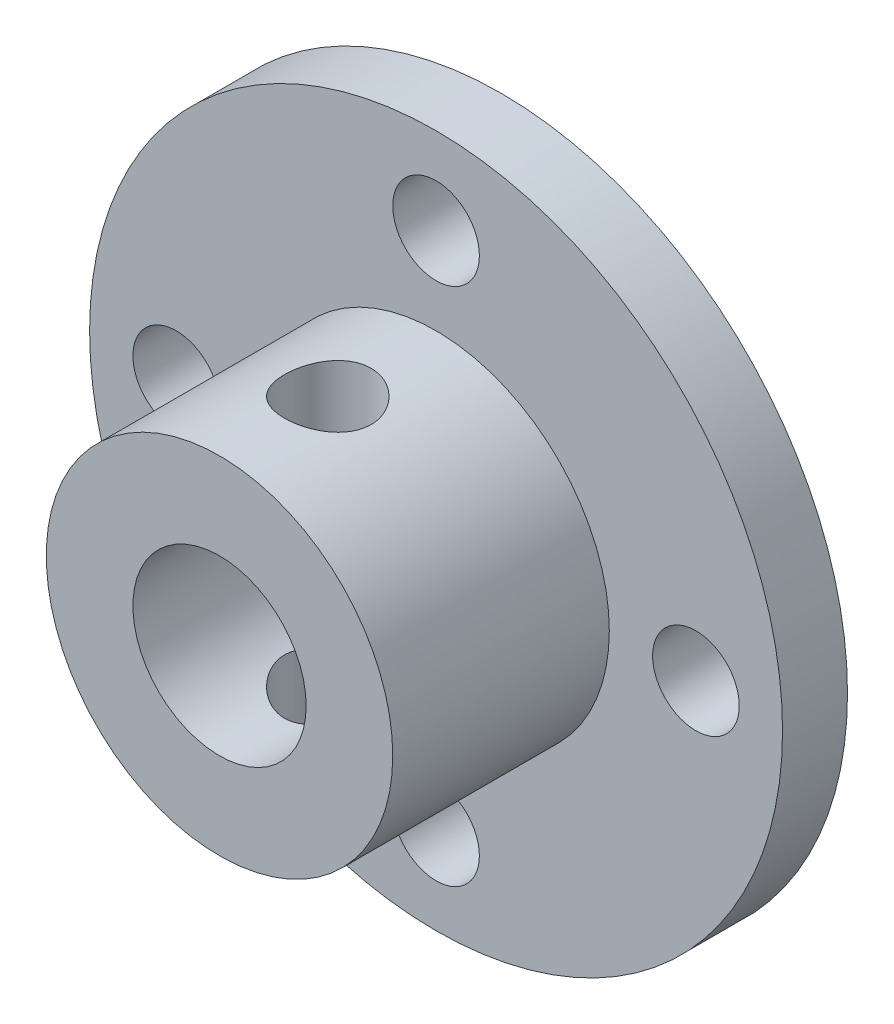
ISO-10303-21;
HEADER;
FILE_DESCRIPTION(('STEP AP214'),'2;1');
FILE_NAME('part.step','',(''),(''),'','','');
FILE_SCHEMA(('AUTOMOTIVE_DESIGN { 1 0 10303 214 1 1 1 1 }'));
ENDSEC;
DATA;
#1=APPLICATION_CONTEXT('core data for automotive mechanical design processes');
#2=APPLICATION_PROTOCOL_DEFINITION('international standard','automotive_design',2000,#1);
#3=PRODUCT_CONTEXT('',#1,'mechanical');
#4=PRODUCT('Part','Part','',(#3));
#5=PRODUCT_RELATED_PRODUCT_CATEGORY('part','',(#4));
#6=PRODUCT_DEFINITION_FORMATION('','',#4);
#7=PRODUCT_DEFINITION_CONTEXT('part definition',#1,'design');
#8=PRODUCT_DEFINITION('design','',#6,#7);
#9=PRODUCT_DEFINITION_SHAPE('','',#8);
#10=(LENGTH_UNIT() NAMED_UNIT(*) SI_UNIT(.MILLI.,.METRE.));
#11=(NAMED_UNIT(*) PLANE_ANGLE_UNIT() SI_UNIT($,.RADIAN.));
#12=(NAMED_UNIT(*) SI_UNIT($,.STERADIAN.) SOLID_ANGLE_UNIT());
#13=UNCERTAINTY_MEASURE_WITH_UNIT(LENGTH_MEASURE(1.E-05),#10,'distance_accuracy_value','');
#14=(GEOMETRIC_REPRESENTATION_CONTEXT(3) GLOBAL_UNCERTAINTY_ASSIGNED_CONTEXT((#13)) GLOBAL_UNIT_ASSIGNED_CONTEXT((#10,
#11,#12)) REPRESENTATION_CONTEXT('',''));
#15=CARTESIAN_POINT('',(0.,0.,0.));
#16=DIRECTION('',(0.,0.,1.));
#17=DIRECTION('',(1.,0.,0.));
#18=AXIS2_PLACEMENT_3D('',#15,#16,#17);
#19=CARTESIAN_POINT('',(0.,0.,3.));
#20=DIRECTION('',(0.,0.,-1.));
#21=DIRECTION('',(-1.,0.,0.));
#22=AXIS2_PLACEMENT_3D('',#19,#20,#21);
#23=CYLINDRICAL_SURFACE('',#22,16.);
#24=CARTESIAN_POINT('',(0.,0.,3.));
#25=DIRECTION('',(0.,0.,1.));
#26=DIRECTION('',(1.,0.,0.));
#27=AXIS2_PLACEMENT_3D('',#24,#25,#26);
#28=CIRCLE('',#27,16.);
#29=CARTESIAN_POINT('',(16.,0.,3.));
#30=VERTEX_POINT('',#29);
#31=EDGE_CURVE('E11',#30,#30,#28,.T.);
#32=ORIENTED_EDGE('',*,*,#31,.F.);
#33=EDGE_LOOP('',(#32));
#34=FACE_BOUND('',#33,.T.);
#35=CARTESIAN_POINT('',(0.,0.,0.));
#36=DIRECTION('',(0.,0.,1.));
#37=DIRECTION('',(1.,0.,0.));
#38=AXIS2_PLACEMENT_3D('',#35,#36,#37);
#39=CIRCLE('',#38,16.);
#40=CARTESIAN_POINT('',(16.,0.,0.));
#41=VERTEX_POINT('',#40);
#42=EDGE_CURVE('E44',#41,#41,#39,.T.);
#43=ORIENTED_EDGE('',*,*,#42,.T.);
#44=EDGE_LOOP('',(#43));
#45=FACE_BOUND('',#44,.T.);
#46=ADVANCED_FACE('F37',(#34,#45),#23,.T.);
#47=CARTESIAN_POINT('',(0.,0.,3.));
#48=DIRECTION('',(0.,0.,1.));
#49=DIRECTION('',(1.,0.,0.));
#50=AXIS2_PLACEMENT_3D('',#47,#48,#49);
#51=PLANE('',#50);
#52=CARTESIAN_POINT('',(0.,12.,3.));
#53=DIRECTION('',(0.,0.,1.));
#54=DIRECTION('',(1.,0.,0.));
#55=AXIS2_PLACEMENT_3D('',#52,#53,#54);
#56=CIRCLE('',#55,2.);
#57=CARTESIAN_POINT('',(2.,12.,3.));
#58=VERTEX_POINT('',#57);
#59=EDGE_CURVE('E246',#58,#58,#56,.T.);
#60=ORIENTED_EDGE('',*,*,#59,.F.);
#61=EDGE_LOOP('',(#60));
#62=FACE_BOUND('',#61,.T.);
#63=CARTESIAN_POINT('',(12.,0.,3.));
#64=DIRECTION('',(0.,0.,1.));
#65=DIRECTION('',(1.,0.,0.));
#66=AXIS2_PLACEMENT_3D('',#63,#64,#65);
#67=CIRCLE('',#66,2.);
#68=CARTESIAN_POINT('',(14.,0.,3.));
#69=VERTEX_POINT('',#68);
#70=EDGE_CURVE('E269',#69,#69,#67,.T.);
#71=ORIENTED_EDGE('',*,*,#70,.F.);
#72=EDGE_LOOP('',(#71));
#73=FACE_BOUND('',#72,.T.);
#74=CARTESIAN_POINT('',(0.,-12.,3.));
#75=DIRECTION('',(0.,0.,1.));
#76=DIRECTION('',(1.,0.,0.));
#77=AXIS2_PLACEMENT_3D('',#74,#75,#76);
#78=CIRCLE('',#77,2.);
#79=CARTESIAN_POINT('',(2.,-12.,3.));
#80=VERTEX_POINT('',#79);
#81=EDGE_CURVE('E263',#80,#80,#78,.T.);
#82=ORIENTED_EDGE('',*,*,#81,.F.);
#83=EDGE_LOOP('',(#82));
#84=FACE_BOUND('',#83,.T.);
#85=CARTESIAN_POINT('',(-12.,0.,3.));
#86=DIRECTION('',(0.,0.,1.));
#87=DIRECTION('',(1.,0.,0.));
#88=AXIS2_PLACEMENT_3D('',#85,#86,#87);
#89=CIRCLE('',#88,2.);
#90=CARTESIAN_POINT('',(-10.,0.,3.));
#91=VERTEX_POINT('',#90);
#92=EDGE_CURVE('E257',#91,#91,#89,.T.);
#93=ORIENTED_EDGE('',*,*,#92,.F.);
#94=EDGE_LOOP('',(#93));
#95=FACE_BOUND('',#94,.T.);
#96=CARTESIAN_POINT('',(0.,0.,3.));
#97=DIRECTION('',(0.,0.,1.));
#98=DIRECTION('',(1.,0.,0.));
#99=AXIS2_PLACEMENT_3D('',#96,#97,#98);
#100=CIRCLE('',#99,8.);
#101=CARTESIAN_POINT('',(8.,0.,3.));
#102=VERTEX_POINT('',#101);
#103=EDGE_CURVE('E52',#102,#102,#100,.T.);
#104=ORIENTED_EDGE('',*,*,#103,.F.);
#105=EDGE_LOOP('',(#104));
#106=FACE_BOUND('',#105,.T.);
#107=ORIENTED_EDGE('',*,*,#31,.T.);
#108=EDGE_LOOP('',(#107));
#109=FACE_BOUND('',#108,.T.);
#110=ADVANCED_FACE('F100',(#62,#73,#84,#95,#106,#109),#51,.T.);
#111=CARTESIAN_POINT('',(0.,0.,0.));
#112=DIRECTION('',(0.,0.,1.));
#113=DIRECTION('',(1.,0.,0.));
#114=AXIS2_PLACEMENT_3D('',#111,#112,#113);
#115=PLANE('',#114);
#116=CARTESIAN_POINT('',(0.,0.,0.));
#117=DIRECTION('',(0.,0.,1.));
#118=DIRECTION('',(1.,0.,0.));
#119=AXIS2_PLACEMENT_3D('',#116,#117,#118);
#120=CIRCLE('',#119,4.);
#121=CARTESIAN_POINT('',(4.,0.,0.));
#122=VERTEX_POINT('',#121);
#123=EDGE_CURVE('E40',#122,#122,#120,.T.);
#124=ORIENTED_EDGE('',*,*,#123,.T.);
#125=EDGE_LOOP('',(#124));
#126=FACE_BOUND('',#125,.T.);
#127=CARTESIAN_POINT('',(0.,12.,0.));
#128=DIRECTION('',(0.,0.,1.));
#129=DIRECTION('',(1.,0.,0.));
#130=AXIS2_PLACEMENT_3D('',#127,#128,#129);
#131=CIRCLE('',#130,2.);
#132=CARTESIAN_POINT('',(2.,12.,0.));
#133=VERTEX_POINT('',#132);
#134=EDGE_CURVE('E242',#133,#133,#131,.T.);
#135=ORIENTED_EDGE('',*,*,#134,.T.);
#136=EDGE_LOOP('',(#135));
#137=FACE_BOUND('',#136,.T.);
#138=CARTESIAN_POINT('',(12.,0.,0.));
#139=DIRECTION('',(0.,0.,1.));
#140=DIRECTION('',(1.,0.,0.));
#141=AXIS2_PLACEMENT_3D('',#138,#139,#140);
#142=CIRCLE('',#141,2.);
#143=CARTESIAN_POINT('',(14.,0.,0.));
#144=VERTEX_POINT('',#143);
#145=EDGE_CURVE('E266',#144,#144,#142,.T.);
#146=ORIENTED_EDGE('',*,*,#145,.T.);
#147=EDGE_LOOP('',(#146));
#148=FACE_BOUND('',#147,.T.);
#149=CARTESIAN_POINT('',(0.,-12.,0.));
#150=DIRECTION('',(0.,0.,1.));
#151=DIRECTION('',(1.,0.,0.));
#152=AXIS2_PLACEMENT_3D('',#149,#150,#151);
#153=CIRCLE('',#152,2.);
#154=CARTESIAN_POINT('',(2.,-12.,0.));
#155=VERTEX_POINT('',#154);
#156=EDGE_CURVE('E260',#155,#155,#153,.T.);
#157=ORIENTED_EDGE('',*,*,#156,.T.);
#158=EDGE_LOOP('',(#157));
#159=FACE_BOUND('',#158,.T.);
#160=CARTESIAN_POINT('',(-12.,0.,0.));
#161=DIRECTION('',(0.,0.,1.));
#162=DIRECTION('',(1.,0.,0.));
#163=AXIS2_PLACEMENT_3D('',#160,#161,#162);
#164=CIRCLE('',#163,2.);
#165=CARTESIAN_POINT('',(-10.,0.,0.));
#166=VERTEX_POINT('',#165);
#167=EDGE_CURVE('E248',#166,#166,#164,.T.);
#168=ORIENTED_EDGE('',*,*,#167,.T.);
#169=EDGE_LOOP('',(#168));
#170=FACE_BOUND('',#169,.T.);
#171=ORIENTED_EDGE('',*,*,#42,.F.);
#172=EDGE_LOOP('',(#171));
#173=FACE_BOUND('',#172,.T.);
#174=ADVANCED_FACE('F103',(#126,#137,#148,#159,#170,#173),#115,.F.);
#175=CARTESIAN_POINT('',(0.,0.,13.));
#176=DIRECTION('',(0.,0.,1.));
#177=DIRECTION('',(1.,0.,0.));
#178=AXIS2_PLACEMENT_3D('',#175,#176,#177);
#179=PLANE('',#178);
#180=CARTESIAN_POINT('',(0.,0.,13.));
#181=DIRECTION('',(0.,0.,1.));
#182=DIRECTION('',(1.,0.,0.));
#183=AXIS2_PLACEMENT_3D('',#180,#181,#182);
#184=CIRCLE('',#183,8.);
#185=CARTESIAN_POINT('',(8.,0.,13.));
#186=VERTEX_POINT('',#185);
#187=EDGE_CURVE('E49',#186,#186,#184,.T.);
#188=ORIENTED_EDGE('',*,*,#187,.T.);
#189=EDGE_LOOP('',(#188));
#190=FACE_BOUND('',#189,.T.);
#191=CARTESIAN_POINT('',(0.,0.,13.));
#192=DIRECTION('',(0.,0.,1.));
#193=DIRECTION('',(1.,0.,0.));
#194=AXIS2_PLACEMENT_3D('',#191,#192,#193);
#195=CIRCLE('',#194,4.);
#196=CARTESIAN_POINT('',(4.,0.,13.));
#197=VERTEX_POINT('',#196);
#198=EDGE_CURVE('E239',#197,#197,#195,.T.);
#199=ORIENTED_EDGE('',*,*,#198,.F.);
#200=EDGE_LOOP('',(#199));
#201=FACE_BOUND('',#200,.T.);
#202=ADVANCED_FACE('F98',(#190,#201),#179,.T.);
#203=CARTESIAN_POINT('',(0.,0.,13.));
#204=DIRECTION('',(0.,0.,-1.));
#205=DIRECTION('',(-1.,0.,0.));
#206=AXIS2_PLACEMENT_3D('',#203,#204,#205);
#207=CYLINDRICAL_SURFACE('',#206,8.);
#208=CARTESIAN_POINT('',(0.,-8.,10.));
#209=CARTESIAN_POINT('',(0.110501451559642,-7.9999981315735,9.99999689901579));
#210=CARTESIAN_POINT('',(0.221037543774351,-7.99768770842435,9.99081126563495));
#211=CARTESIAN_POINT('',(0.438941765027377,-7.98869485106526,9.95436646492399));
#212=CARTESIAN_POINT('',(0.546308062494319,-7.98200993893301,9.92709705394953));
#213=CARTESIAN_POINT('',(0.754694496243435,-7.96500835109376,9.85541432871722));
#214=CARTESIAN_POINT('',(0.855722084573335,-7.95469603789411,9.81102160171298));
#215=CARTESIAN_POINT('',(1.04889617587257,-7.93153791743495,9.70642481327355));
#216=CARTESIAN_POINT('',(1.14104237913168,-7.91869202472209,9.64622021850804));
#217=CARTESIAN_POINT('',(1.31573590306789,-7.89156551455591,9.51039894712776));
#218=CARTESIAN_POINT('',(1.39807425341474,-7.87726276197502,9.43451790005459));
#219=CARTESIAN_POINT('',(1.54899856960443,-7.84898160157248,9.27006372678795));
#220=CARTESIAN_POINT('',(1.61758298259892,-7.83500323053157,9.18148916940409));
#221=CARTESIAN_POINT('',(1.74003539039863,-7.80873034264225,8.99253969768401));
#222=CARTESIAN_POINT('',(1.79366962123352,-7.79646392619748,8.89200902558836));
#223=CARTESIAN_POINT('',(1.88319587806766,-7.77532659757355,8.68300211778662));
#224=CARTESIAN_POINT('',(1.91909074058685,-7.76645514259225,8.57452715555731));
#225=CARTESIAN_POINT('',(1.97140644907302,-7.7533396892843,8.35500866906445));
#226=CARTESIAN_POINT('',(1.98820302444274,-7.74900654662681,8.24406013861601));
#227=CARTESIAN_POINT('',(2.00301570008854,-7.74519149946122,8.02084190800087));
#228=CARTESIAN_POINT('',(2.00103485575748,-7.74570880570571,7.90857242574382));
#229=CARTESIAN_POINT('',(1.97864869951961,-7.75145607355756,7.6887789230062));
#230=CARTESIAN_POINT('',(1.95869112025418,-7.75657150676391,7.58120583804623));
#231=CARTESIAN_POINT('',(1.90163224920399,-7.77075612894758,7.37098526545192));
#232=CARTESIAN_POINT('',(1.86452973609252,-7.77982559958985,7.26833812929477));
#233=CARTESIAN_POINT('',(1.77385263724958,-7.80100151874212,7.06968264499716));
#234=CARTESIAN_POINT('',(1.72011555631056,-7.81313769959755,6.97375177094724));
#235=CARTESIAN_POINT('',(1.59780836801993,-7.83906281127988,6.79210838699091));
#236=CARTESIAN_POINT('',(1.52923566507845,-7.85285203112837,6.70639766924367));
#237=CARTESIAN_POINT('',(1.37688456624163,-7.88101174053188,6.54506184574079));
#238=CARTESIAN_POINT('',(1.29272834422115,-7.89538759304001,6.46979401325153));
#239=CARTESIAN_POINT('',(1.11281589000493,-7.92274620771675,6.3343716767148));
#240=CARTESIAN_POINT('',(1.01705930361059,-7.93572892732543,6.27421763431525));
#241=CARTESIAN_POINT('',(0.816154518241856,-7.9589030945892,6.17059921836749));
#242=CARTESIAN_POINT('',(0.710975190944831,-7.96908480170303,6.12719287966076));
#243=CARTESIAN_POINT('',(0.49450134419051,-7.98543889321888,6.05877692572057));
#244=CARTESIAN_POINT('',(0.383207998867313,-7.99161204452374,6.03376379144248));
#245=CARTESIAN_POINT('',(0.160719960520036,-7.999139990285,6.00338991258822));
#246=CARTESIAN_POINT('',(0.0495956266509465,-8.00061404677705,5.9975426318996));
#247=CARTESIAN_POINT('',(-0.172043833068677,-7.99891739752601,6.00433200274065));
#248=CARTESIAN_POINT('',(-0.28255901285946,-7.99574710989128,6.01696699039884));
#249=CARTESIAN_POINT('',(-0.498152358368656,-7.98519441503143,6.05996121118851));
#250=CARTESIAN_POINT('',(-0.603286825291673,-7.97787512247748,6.09005501796932));
#251=CARTESIAN_POINT('',(-0.807009723270016,-7.95984942178845,6.16680944537126));
#252=CARTESIAN_POINT('',(-0.905597492043513,-7.94914267159856,6.21347173908423));
#253=CARTESIAN_POINT('',(-1.0953641792398,-7.92524410568414,6.3229815051663));
#254=CARTESIAN_POINT('',(-1.18638058911444,-7.91201156489243,6.38610148319568));
#255=CARTESIAN_POINT('',(-1.35670215152433,-7.88459345583226,6.52638654506263));
#256=CARTESIAN_POINT('',(-1.43600527863068,-7.87040772335606,6.60355405282254));
#257=CARTESIAN_POINT('',(-1.58265409076364,-7.84225275947695,6.77200261445929));
#258=CARTESIAN_POINT('',(-1.64965849016271,-7.82829738916375,6.86358360400323));
#259=CARTESIAN_POINT('',(-1.7673476786836,-7.80257171169652,7.05697684595429));
#260=CARTESIAN_POINT('',(-1.81803319221058,-7.79080130756035,7.15878864394634));
#261=CARTESIAN_POINT('',(-1.90126856081239,-7.77090792979553,7.36920762988411));
#262=CARTESIAN_POINT('',(-1.93392586220542,-7.76276340389207,7.47777017112535));
#263=CARTESIAN_POINT('',(-1.98046087993837,-7.75102325453578,7.69907951718548));
#264=CARTESIAN_POINT('',(-1.99434270330488,-7.74742663626582,7.81182540137665));
#265=CARTESIAN_POINT('',(-2.00271812044533,-7.74526534938609,8.03482803180694));
#266=CARTESIAN_POINT('',(-1.99775719704016,-7.74655910304351,8.14506324683297));
#267=CARTESIAN_POINT('',(-1.96983637108382,-7.7537054534379,8.36307185155731));
#268=CARTESIAN_POINT('',(-1.94687683024903,-7.75955795855809,8.47084529068487));
#269=CARTESIAN_POINT('',(-1.88390842592373,-7.77508347576963,8.68027794542054));
#270=CARTESIAN_POINT('',(-1.84400187290717,-7.78473353648412,8.78196974032028));
#271=CARTESIAN_POINT('',(-1.74835321814009,-7.80677007633105,8.97728717695159));
#272=CARTESIAN_POINT('',(-1.69260892004558,-7.81915693494364,9.07091169758256));
#273=CARTESIAN_POINT('',(-1.56515699818285,-7.8456751235135,9.25007283866936));
#274=CARTESIAN_POINT('',(-1.49307088388301,-7.85984353109009,9.33533476456528));
#275=CARTESIAN_POINT('',(-1.33571916158631,-7.88810702995048,9.49272939306054));
#276=CARTESIAN_POINT('',(-1.25045042834819,-7.90220210302746,9.56485897348396));
#277=CARTESIAN_POINT('',(-1.06729011560345,-7.92903540863551,9.69521507808614));
#278=CARTESIAN_POINT('',(-0.96919789642185,-7.94174444487824,9.75316615156211));
#279=CARTESIAN_POINT('',(-0.764354746013969,-7.96406566633491,9.85166328392071));
#280=CARTESIAN_POINT('',(-0.65761008458232,-7.97368006933042,9.89222181419805));
#281=CARTESIAN_POINT('',(-0.459213670991295,-7.98730746087389,9.94876244043954));
#282=CARTESIAN_POINT('',(-0.368506894544091,-7.9920344673692,9.96793499073791));
#283=CARTESIAN_POINT('',(-0.185208095381711,-7.99838140309264,9.99355459149592));
#284=CARTESIAN_POINT('',(-0.0926162149901549,-8.00000156601192,10.0000025990737));
#285=CARTESIAN_POINT('',(0.,-8.,10.));
#286=B_SPLINE_CURVE_WITH_KNOTS('',3,(#208,#209,#210,#211,#212,#213,#214,#215,#216,#217,#218,
#219,#220,#221,#222,#223,#224,#225,#226,#227,#228,#229,#230,#231,#232,#233,#234,#235,#236,#237,
#238,#239,#240,#241,#242,#243,#244,#245,#246,#247,#248,#249,#250,#251,#252,#253,#254,#255,#256,
#257,#258,#259,#260,#261,#262,#263,#264,#265,#266,#267,#268,#269,#270,#271,#272,#273,#274,#275,
#276,#277,#278,#279,#280,#281,#282,#283,#284,#285),.UNSPECIFIED.,.T.,.F.,(4,2,2,2,2,2,2,2,2,2,2,
2,2,2,2,2,2,2,2,2,2,2,2,2,2,2,2,2,2,2,2,2,2,2,2,2,2,2,4),(0.,0.33116494996252,0.662517650351866,
0.99347320304814,1.32443992022577,1.66152580582852,1.99864972773416,2.34078196727742,
2.68285948225824,3.01808393468093,3.3532538415469,3.68029996013785,4.00736937959145,
4.337740371696,4.66816921119311,5.00802001296453,5.34788119415424,5.6889097201658,
6.02987298255951,6.36211078603462,6.69431868154751,7.02160366023144,7.34892169767481,
7.68204783424897,8.01523150681786,8.35659345610396,8.69794025003772,9.03723006156476,
9.37644564340972,9.70591707202578,10.0353818794581,10.3628853408369,10.6904342418696,
11.0265276855097,11.3627009303165,11.7049624733721,12.0469781843289,12.3245632392729,
12.6021274139515),.UNSPECIFIED.);
#287=CARTESIAN_POINT('',(0.,-8.,10.));
#288=VERTEX_POINT('',#287);
#289=EDGE_CURVE('E89',#288,#288,#286,.T.);
#290=ORIENTED_EDGE('',*,*,#289,.T.);
#291=EDGE_LOOP('',(#290));
#292=FACE_BOUND('',#291,.T.);
#293=CARTESIAN_POINT('',(0.,8.,10.));
#294=CARTESIAN_POINT('',(-0.110501451559642,7.9999981315735,9.99999689901579));
#295=CARTESIAN_POINT('',(-0.221037543774351,7.99768770842435,9.99081126563495));
#296=CARTESIAN_POINT('',(-0.438941765027377,7.98869485106526,9.95436646492399));
#297=CARTESIAN_POINT('',(-0.546308062494319,7.98200993893301,9.92709705394953));
#298=CARTESIAN_POINT('',(-0.754694496243435,7.96500835109376,9.85541432871722));
#299=CARTESIAN_POINT('',(-0.855722084573335,7.95469603789411,9.81102160171298));
#300=CARTESIAN_POINT('',(-1.04889617587257,7.93153791743495,9.70642481327355));
#301=CARTESIAN_POINT('',(-1.14104237913168,7.91869202472209,9.64622021850804));
#302=CARTESIAN_POINT('',(-1.31573590306789,7.89156551455591,9.51039894712776));
#303=CARTESIAN_POINT('',(-1.39807425341474,7.87726276197502,9.43451790005459));
#304=CARTESIAN_POINT('',(-1.54899856960443,7.84898160157248,9.27006372678795));
#305=CARTESIAN_POINT('',(-1.61758298259892,7.83500323053157,9.18148916940409));
#306=CARTESIAN_POINT('',(-1.74003539039863,7.80873034264225,8.99253969768401));
#307=CARTESIAN_POINT('',(-1.79366962123352,7.79646392619748,8.89200902558836));
#308=CARTESIAN_POINT('',(-1.88319587806766,7.77532659757355,8.68300211778662));
#309=CARTESIAN_POINT('',(-1.91909074058685,7.76645514259225,8.57452715555731));
#310=CARTESIAN_POINT('',(-1.97140644907302,7.7533396892843,8.35500866906445));
#311=CARTESIAN_POINT('',(-1.98820302444274,7.74900654662681,8.24406013861601));
#312=CARTESIAN_POINT('',(-2.00301570008854,7.74519149946122,8.02084190800087));
#313=CARTESIAN_POINT('',(-2.00103485575748,7.74570880570571,7.90857242574382));
#314=CARTESIAN_POINT('',(-1.97864869951961,7.75145607355756,7.6887789230062));
#315=CARTESIAN_POINT('',(-1.95869112025418,7.75657150676391,7.58120583804623));
#316=CARTESIAN_POINT('',(-1.90163224920399,7.77075612894758,7.37098526545192));
#317=CARTESIAN_POINT('',(-1.86452973609252,7.77982559958985,7.26833812929477));
#318=CARTESIAN_POINT('',(-1.77385263724958,7.80100151874212,7.06968264499716));
#319=CARTESIAN_POINT('',(-1.72011555631056,7.81313769959755,6.97375177094724));
#320=CARTESIAN_POINT('',(-1.59780836801993,7.83906281127988,6.79210838699091));
#321=CARTESIAN_POINT('',(-1.52923566507845,7.85285203112837,6.70639766924367));
#322=CARTESIAN_POINT('',(-1.37688456624163,7.88101174053188,6.54506184574079));
#323=CARTESIAN_POINT('',(-1.29272834422115,7.89538759304001,6.46979401325153));
#324=CARTESIAN_POINT('',(-1.11281589000493,7.92274620771675,6.3343716767148));
#325=CARTESIAN_POINT('',(-1.01705930361059,7.93572892732543,6.27421763431525));
#326=CARTESIAN_POINT('',(-0.816154518241856,7.9589030945892,6.17059921836749));
#327=CARTESIAN_POINT('',(-0.710975190944831,7.96908480170303,6.12719287966076));
#328=CARTESIAN_POINT('',(-0.49450134419051,7.98543889321888,6.05877692572057));
#329=CARTESIAN_POINT('',(-0.383207998867313,7.99161204452374,6.03376379144248));
#330=CARTESIAN_POINT('',(-0.160719960520036,7.999139990285,6.00338991258822));
#331=CARTESIAN_POINT('',(-0.0495956266509465,8.00061404677705,5.9975426318996));
#332=CARTESIAN_POINT('',(0.172043833068677,7.99891739752601,6.00433200274065));
#333=CARTESIAN_POINT('',(0.28255901285946,7.99574710989128,6.01696699039884));
#334=CARTESIAN_POINT('',(0.498152358368656,7.98519441503143,6.05996121118851));
#335=CARTESIAN_POINT('',(0.603286825291673,7.97787512247748,6.09005501796932));
#336=CARTESIAN_POINT('',(0.807009723270016,7.95984942178845,6.16680944537126));
#337=CARTESIAN_POINT('',(0.905597492043513,7.94914267159856,6.21347173908423));
#338=CARTESIAN_POINT('',(1.0953641792398,7.92524410568414,6.3229815051663));
#339=CARTESIAN_POINT('',(1.18638058911444,7.91201156489243,6.38610148319568));
#340=CARTESIAN_POINT('',(1.35670215152433,7.88459345583226,6.52638654506263));
#341=CARTESIAN_POINT('',(1.43600527863068,7.87040772335606,6.60355405282254));
#342=CARTESIAN_POINT('',(1.58265409076364,7.84225275947695,6.77200261445929));
#343=CARTESIAN_POINT('',(1.64965849016271,7.82829738916375,6.86358360400323));
#344=CARTESIAN_POINT('',(1.7673476786836,7.80257171169652,7.05697684595429));
#345=CARTESIAN_POINT('',(1.81803319221058,7.79080130756035,7.15878864394634));
#346=CARTESIAN_POINT('',(1.90126856081239,7.77090792979553,7.36920762988411));
#347=CARTESIAN_POINT('',(1.93392586220542,7.76276340389207,7.47777017112535));
#348=CARTESIAN_POINT('',(1.98046087993837,7.75102325453578,7.69907951718548));
#349=CARTESIAN_POINT('',(1.99434270330488,7.74742663626582,7.81182540137665));
#350=CARTESIAN_POINT('',(2.00271812044533,7.74526534938609,8.03482803180694));
#351=CARTESIAN_POINT('',(1.99775719704016,7.74655910304351,8.14506324683297));
#352=CARTESIAN_POINT('',(1.96983637108382,7.7537054534379,8.36307185155731));
#353=CARTESIAN_POINT('',(1.94687683024903,7.75955795855809,8.47084529068487));
#354=CARTESIAN_POINT('',(1.88390842592373,7.77508347576963,8.68027794542054));
#355=CARTESIAN_POINT('',(1.84400187290717,7.78473353648412,8.78196974032028));
#356=CARTESIAN_POINT('',(1.74835321814009,7.80677007633105,8.97728717695159));
#357=CARTESIAN_POINT('',(1.69260892004558,7.81915693494364,9.07091169758256));
#358=CARTESIAN_POINT('',(1.56515699818285,7.8456751235135,9.25007283866936));
#359=CARTESIAN_POINT('',(1.49307088388301,7.85984353109009,9.33533476456528));
#360=CARTESIAN_POINT('',(1.33571916158631,7.88810702995048,9.49272939306054));
#361=CARTESIAN_POINT('',(1.25045042834819,7.90220210302746,9.56485897348396));
#362=CARTESIAN_POINT('',(1.06729011560345,7.92903540863551,9.69521507808614));
#363=CARTESIAN_POINT('',(0.96919789642185,7.94174444487824,9.75316615156211));
#364=CARTESIAN_POINT('',(0.764354746013969,7.96406566633491,9.85166328392071));
#365=CARTESIAN_POINT('',(0.65761008458232,7.97368006933042,9.89222181419805));
#366=CARTESIAN_POINT('',(0.459213670991295,7.98730746087389,9.94876244043954));
#367=CARTESIAN_POINT('',(0.368506894544091,7.9920344673692,9.96793499073791));
#368=CARTESIAN_POINT('',(0.185208095381711,7.99838140309264,9.99355459149592));
#369=CARTESIAN_POINT('',(0.0926162149901549,8.00000156601192,10.0000025990737));
#370=CARTESIAN_POINT('',(0.,8.,10.));
#371=B_SPLINE_CURVE_WITH_KNOTS('',3,(#293,#294,#295,#296,#297,#298,#299,#300,#301,#302,#303,
#304,#305,#306,#307,#308,#309,#310,#311,#312,#313,#314,#315,#316,#317,#318,#319,#320,#321,#322,
#323,#324,#325,#326,#327,#328,#329,#330,#331,#332,#333,#334,#335,#336,#337,#338,#339,#340,#341,
#342,#343,#344,#345,#346,#347,#348,#349,#350,#351,#352,#353,#354,#355,#356,#357,#358,#359,#360,
#361,#362,#363,#364,#365,#366,#367,#368,#369,#370),.UNSPECIFIED.,.T.,.F.,(4,2,2,2,2,2,2,2,2,2,2,
2,2,2,2,2,2,2,2,2,2,2,2,2,2,2,2,2,2,2,2,2,2,2,2,2,2,2,4),(0.,0.33116494996252,0.662517650351866,
0.99347320304814,1.32443992022577,1.66152580582852,1.99864972773416,2.34078196727742,
2.68285948225824,3.01808393468093,3.3532538415469,3.68029996013785,4.00736937959145,
4.337740371696,4.66816921119311,5.00802001296453,5.34788119415424,5.6889097201658,
6.02987298255951,6.36211078603462,6.69431868154751,7.02160366023144,7.34892169767481,
7.68204783424897,8.01523150681786,8.35659345610396,8.69794025003772,9.03723006156476,
9.37644564340972,9.70591707202578,10.0353818794581,10.3628853408369,10.6904342418696,
11.0265276855097,11.3627009303165,11.7049624733721,12.0469781843289,12.3245632392729,
12.6021274139515),.UNSPECIFIED.);
#372=CARTESIAN_POINT('',(0.,8.,10.));
#373=VERTEX_POINT('',#372);
#374=EDGE_CURVE('E83',#373,#373,#371,.T.);
#375=ORIENTED_EDGE('',*,*,#374,.T.);
#376=EDGE_LOOP('',(#375));
#377=FACE_BOUND('',#376,.T.);
#378=ORIENTED_EDGE('',*,*,#187,.F.);
#379=EDGE_LOOP('',(#378));
#380=FACE_BOUND('',#379,.T.);
#381=ORIENTED_EDGE('',*,*,#103,.T.);
#382=EDGE_LOOP('',(#381));
#383=FACE_BOUND('',#382,.T.);
#384=ADVANCED_FACE('F94',(#292,#377,#380,#383),#207,.T.);
#385=CARTESIAN_POINT('',(0.,0.,13.));
#386=DIRECTION('',(0.,0.,-1.));
#387=DIRECTION('',(-1.,0.,0.));
#388=AXIS2_PLACEMENT_3D('',#385,#386,#387);
#389=CYLINDRICAL_SURFACE('',#388,4.);
#390=CARTESIAN_POINT('',(0.,-4.,10.));
#391=CARTESIAN_POINT('',(0.105143925902467,-3.99999426810082,9.99999339536562));
#392=CARTESIAN_POINT('',(0.210413199395125,-3.99580982039513,9.99165985375789));
#393=CARTESIAN_POINT('',(0.417840470537792,-3.97948312074314,9.95869423931692));
#394=CARTESIAN_POINT('',(0.519992173427259,-3.96732575657839,9.93403121400437));
#395=CARTESIAN_POINT('',(0.717867089760898,-3.93632558806751,9.86961238276674));
#396=CARTESIAN_POINT('',(0.813613605878293,-3.91750878355075,9.82991523150407));
#397=CARTESIAN_POINT('',(0.996945233613197,-3.87491553031523,9.73685875727003));
#398=CARTESIAN_POINT('',(1.08453098798012,-3.85113947267051,9.68350051150227));
#399=CARTESIAN_POINT('',(1.25501563552382,-3.79912516516124,9.56096550102943));
#400=CARTESIAN_POINT('',(1.33731042224422,-3.77070398255074,9.49102704152072));
#401=CARTESIAN_POINT('',(1.48955888973396,-3.71319940493486,9.33895704150593));
#402=CARTESIAN_POINT('',(1.55950316621353,-3.68411552418069,9.25681629645512));
#403=CARTESIAN_POINT('',(1.69050400090055,-3.62597902394695,9.07503330095324));
#404=CARTESIAN_POINT('',(1.75045067110327,-3.59710373940264,8.97452780330818));
#405=CARTESIAN_POINT('',(1.85233645378139,-3.54571957544641,8.76326532802757));
#406=CARTESIAN_POINT('',(1.89428842993267,-3.52320615213979,8.6525157425545));
#407=CARTESIAN_POINT('',(1.95626488437718,-3.48915734075617,8.43066978915616));
#408=CARTESIAN_POINT('',(1.97745171416088,-3.47704543167427,8.31999109586521));
#409=CARTESIAN_POINT('',(2.00085398661769,-3.46363779897055,8.09604232444105));
#410=CARTESIAN_POINT('',(2.00308817674615,-3.46233138686576,7.98277491825769));
#411=CARTESIAN_POINT('',(1.98937457434459,-3.47021860514497,7.77142795136926));
#412=CARTESIAN_POINT('',(1.97556911907364,-3.47817527324027,7.6731519375539));
#413=CARTESIAN_POINT('',(1.93387969811386,-3.50152457467701,7.48055618125392));
#414=CARTESIAN_POINT('',(1.9059912477953,-3.51691957663553,7.38623770938937));
#415=CARTESIAN_POINT('',(1.83641956077201,-3.55374952825482,7.20154173486868));
#416=CARTESIAN_POINT('',(1.79443013423199,-3.57531681327997,7.11130720242842));
#417=CARTESIAN_POINT('',(1.698083375336,-3.62206808562807,6.93873141481998));
#418=CARTESIAN_POINT('',(1.64372048762493,-3.64725369560381,6.85639372879982));
#419=CARTESIAN_POINT('',(1.51613210982558,-3.70226315806572,6.69095749451355));
#420=CARTESIAN_POINT('',(1.44138891673856,-3.73227020473492,6.60908625284769));
#421=CARTESIAN_POINT('',(1.27911115748275,-3.79095246600814,6.4585291628182));
#422=CARTESIAN_POINT('',(1.19157051314857,-3.81962703917602,6.38984961593223));
#423=CARTESIAN_POINT('',(1.0010330116637,-3.87403974565928,6.26462867794055));
#424=CARTESIAN_POINT('',(0.897507183198818,-3.89957968324015,6.20879905510852));
#425=CARTESIAN_POINT('',(0.680932430977593,-3.94315762242485,6.11580594191398));
#426=CARTESIAN_POINT('',(0.567891152530552,-3.96120157887106,6.07862762996967));
#427=CARTESIAN_POINT('',(0.345532983321405,-3.98648667482871,6.02704919256665));
#428=CARTESIAN_POINT('',(0.236683061096653,-3.9944987660262,6.01101752850644));
#429=CARTESIAN_POINT('',(0.0175591998987036,-4.00146026918207,5.99707053773103));
#430=CARTESIAN_POINT('',(-0.0927140397398171,-4.00041397442637,5.99914662872106));
#431=CARTESIAN_POINT('',(-0.302465943971973,-3.9898238450687,6.02041337683749));
#432=CARTESIAN_POINT('',(-0.40211881609986,-3.98094491376337,6.03826506545999));
#433=CARTESIAN_POINT('',(-0.596813784603882,-3.95644342629681,6.08847614379024));
#434=CARTESIAN_POINT('',(-0.691855371382174,-3.94082012668824,6.12083713290699));
#435=CARTESIAN_POINT('',(-0.877777216899145,-3.90368502827176,6.19999693286607));
#436=CARTESIAN_POINT('',(-0.968460794011606,-3.88201763539262,6.24718210023257));
#437=CARTESIAN_POINT('',(-1.14092272339854,-3.83487948634835,6.35421507129313));
#438=CARTESIAN_POINT('',(-1.22269725955318,-3.80940711133877,6.41406826919079));
#439=CARTESIAN_POINT('',(-1.38353537857843,-3.75416442672396,6.55152085066143));
#440=CARTESIAN_POINT('',(-1.46154415563805,-3.72421769686998,6.63028573689029));
#441=CARTESIAN_POINT('',(-1.60371264223771,-3.6652478321764,6.79985030255546));
#442=CARTESIAN_POINT('',(-1.66786277142375,-3.63622534800094,6.89065823769584));
#443=CARTESIAN_POINT('',(-1.78341582895804,-3.58102384412979,7.08728730834595));
#444=CARTESIAN_POINT('',(-1.8340509916005,-3.55505059178121,7.19362253218896));
#445=CARTESIAN_POINT('',(-1.91616565186941,-3.51148144588269,7.41502013514993));
#446=CARTESIAN_POINT('',(-1.94766983173403,-3.493874764435,7.53007105293378));
#447=CARTESIAN_POINT('',(-1.98772337493374,-3.47123002051604,7.75382044576941));
#448=CARTESIAN_POINT('',(-1.9981859928109,-3.4651476693013,7.86206850687048));
#449=CARTESIAN_POINT('',(-2.0013783087524,-3.46330709283206,8.07889413432905));
#450=CARTESIAN_POINT('',(-1.99411569324648,-3.4675443925278,8.18747153747572));
#451=CARTESIAN_POINT('',(-1.96385225118662,-3.48475724102153,8.39096700306687));
#452=CARTESIAN_POINT('',(-1.94241662868607,-3.49686188965317,8.48620094028948));
#453=CARTESIAN_POINT('',(-1.88635071644882,-3.52742032375305,8.67161623884873));
#454=CARTESIAN_POINT('',(-1.85171618231984,-3.54587615139337,8.76179596418406));
#455=CARTESIAN_POINT('',(-1.76763149060113,-3.58857060729071,8.94124970197307));
#456=CARTESIAN_POINT('',(-1.7173422756314,-3.61311444791841,9.03005580365806));
#457=CARTESIAN_POINT('',(-1.60430194327478,-3.66470663269721,9.19854907236252));
#458=CARTESIAN_POINT('',(-1.54154434248312,-3.69175627591221,9.27823146104222));
#459=CARTESIAN_POINT('',(-1.39640665332275,-3.74924646316184,9.43628396470935));
#460=CARTESIAN_POINT('',(-1.31256884599452,-3.77969966613256,9.51331820470058));
#461=CARTESIAN_POINT('',(-1.13230961246639,-3.83755504519861,9.65252596687054));
#462=CARTESIAN_POINT('',(-1.03588144661039,-3.8649555725239,9.71469147893981));
#463=CARTESIAN_POINT('',(-0.831863193565892,-3.91396019133075,9.82247272542414));
#464=CARTESIAN_POINT('',(-0.724199007553462,-3.93552192987866,9.86796833847293));
#465=CARTESIAN_POINT('',(-0.501484202276173,-3.97002682597974,9.93961633551482));
#466=CARTESIAN_POINT('',(-0.3864555991782,-3.98299446726136,9.96582369361143));
#467=CARTESIAN_POINT('',(-0.22520389298179,-3.99390923826956,9.98779482217148));
#468=CARTESIAN_POINT('',(-0.180323758883129,-3.99618730680502,9.99236528173268));
#469=CARTESIAN_POINT('',(-0.0903034636101829,-3.99923393953631,9.99846933102817));
#470=CARTESIAN_POINT('',(-0.0451632952932568,-4.00000246206762,10.0000028369404));
#471=CARTESIAN_POINT('',(0.,-4.,10.));
#472=B_SPLINE_CURVE_WITH_KNOTS('',3,(#390,#391,#392,#393,#394,#395,#396,#397,#398,#399,#400,
#401,#402,#403,#404,#405,#406,#407,#408,#409,#410,#411,#412,#413,#414,#415,#416,#417,#418,#419,
#420,#421,#422,#423,#424,#425,#426,#427,#428,#429,#430,#431,#432,#433,#434,#435,#436,#437,#438,
#439,#440,#441,#442,#443,#444,#445,#446,#447,#448,#449,#450,#451,#452,#453,#454,#455,#456,#457,
#458,#459,#460,#461,#462,#463,#464,#465,#466,#467,#468,#469,#470,#471),.UNSPECIFIED.,.T.,.F.,(4,
2,2,2,2,2,2,2,2,2,2,2,2,2,2,2,2,2,2,2,2,2,2,2,2,2,2,2,2,2,2,2,2,2,2,2,2,2,2,2,4),(0.,
0.315248514840585,0.631096299418395,0.945724310984597,1.26032752116314,1.59396351743618,
1.92785247530807,2.28763452861505,2.64715895796562,2.98516024280459,3.32282714658041,
3.62011424818641,3.91749607851357,4.22180480336975,4.52625042520444,4.86929882667757,
5.21251069197373,5.57166044428881,5.93052433824559,6.25966580942691,6.58865129022952,
6.89213813012244,7.19565843261863,7.50785712055797,7.82018901496678,8.16319221288837,
8.50643177230863,8.86629364323451,9.22569023890901,9.55058615006093,9.87534119729357,
10.1691586049771,10.463070575767,10.7767291356057,11.0905512228726,11.4425048551434,
11.7946476676249,12.1492802732705,12.502898172423,12.6383056026783,12.7737167702213),.UNSPECIFIED.);
#473=CARTESIAN_POINT('',(0.,-4.,10.));
#474=VERTEX_POINT('',#473);
#475=EDGE_CURVE('E62',#474,#474,#472,.T.);
#476=ORIENTED_EDGE('',*,*,#475,.F.);
#477=EDGE_LOOP('',(#476));
#478=FACE_BOUND('',#477,.T.);
#479=CARTESIAN_POINT('',(0.,4.,10.));
#480=CARTESIAN_POINT('',(-0.105143925902467,3.99999426810082,9.99999339536562));
#481=CARTESIAN_POINT('',(-0.210413199395125,3.99580982039513,9.99165985375789));
#482=CARTESIAN_POINT('',(-0.417840470537792,3.97948312074314,9.95869423931692));
#483=CARTESIAN_POINT('',(-0.519992173427259,3.96732575657839,9.93403121400437));
#484=CARTESIAN_POINT('',(-0.717867089760898,3.93632558806751,9.86961238276674));
#485=CARTESIAN_POINT('',(-0.813613605878293,3.91750878355075,9.82991523150407));
#486=CARTESIAN_POINT('',(-0.996945233613197,3.87491553031523,9.73685875727003));
#487=CARTESIAN_POINT('',(-1.08453098798012,3.85113947267051,9.68350051150227));
#488=CARTESIAN_POINT('',(-1.25501563552382,3.79912516516124,9.56096550102943));
#489=CARTESIAN_POINT('',(-1.33731042224422,3.77070398255074,9.49102704152072));
#490=CARTESIAN_POINT('',(-1.48955888973396,3.71319940493486,9.33895704150593));
#491=CARTESIAN_POINT('',(-1.55950316621353,3.68411552418069,9.25681629645512));
#492=CARTESIAN_POINT('',(-1.69050400090055,3.62597902394695,9.07503330095324));
#493=CARTESIAN_POINT('',(-1.75045067110327,3.59710373940264,8.97452780330818));
#494=CARTESIAN_POINT('',(-1.85233645378139,3.54571957544641,8.76326532802757));
#495=CARTESIAN_POINT('',(-1.89428842993267,3.52320615213979,8.6525157425545));
#496=CARTESIAN_POINT('',(-1.95626488437718,3.48915734075617,8.43066978915616));
#497=CARTESIAN_POINT('',(-1.97745171416088,3.47704543167427,8.31999109586521));
#498=CARTESIAN_POINT('',(-2.00085398661769,3.46363779897055,8.09604232444105));
#499=CARTESIAN_POINT('',(-2.00308817674615,3.46233138686576,7.98277491825769));
#500=CARTESIAN_POINT('',(-1.98937457434459,3.47021860514497,7.77142795136926));
#501=CARTESIAN_POINT('',(-1.97556911907364,3.47817527324027,7.6731519375539));
#502=CARTESIAN_POINT('',(-1.93387969811386,3.50152457467701,7.48055618125392));
#503=CARTESIAN_POINT('',(-1.9059912477953,3.51691957663553,7.38623770938937));
#504=CARTESIAN_POINT('',(-1.83641956077201,3.55374952825482,7.20154173486868));
#505=CARTESIAN_POINT('',(-1.79443013423199,3.57531681327997,7.11130720242842));
#506=CARTESIAN_POINT('',(-1.698083375336,3.62206808562807,6.93873141481998));
#507=CARTESIAN_POINT('',(-1.64372048762493,3.64725369560381,6.85639372879982));
#508=CARTESIAN_POINT('',(-1.51613210982558,3.70226315806572,6.69095749451355));
#509=CARTESIAN_POINT('',(-1.44138891673856,3.73227020473492,6.60908625284769));
#510=CARTESIAN_POINT('',(-1.27911115748275,3.79095246600814,6.4585291628182));
#511=CARTESIAN_POINT('',(-1.19157051314857,3.81962703917602,6.38984961593223));
#512=CARTESIAN_POINT('',(-1.0010330116637,3.87403974565928,6.26462867794055));
#513=CARTESIAN_POINT('',(-0.897507183198818,3.89957968324015,6.20879905510852));
#514=CARTESIAN_POINT('',(-0.680932430977593,3.94315762242485,6.11580594191398));
#515=CARTESIAN_POINT('',(-0.567891152530552,3.96120157887106,6.07862762996967));
#516=CARTESIAN_POINT('',(-0.345532983321405,3.98648667482871,6.02704919256665));
#517=CARTESIAN_POINT('',(-0.236683061096653,3.9944987660262,6.01101752850644));
#518=CARTESIAN_POINT('',(-0.0175591998987036,4.00146026918207,5.99707053773103));
#519=CARTESIAN_POINT('',(0.0927140397398171,4.00041397442637,5.99914662872106));
#520=CARTESIAN_POINT('',(0.302465943971973,3.9898238450687,6.02041337683749));
#521=CARTESIAN_POINT('',(0.40211881609986,3.98094491376337,6.03826506545999));
#522=CARTESIAN_POINT('',(0.596813784603882,3.95644342629681,6.08847614379024));
#523=CARTESIAN_POINT('',(0.691855371382174,3.94082012668824,6.12083713290699));
#524=CARTESIAN_POINT('',(0.877777216899145,3.90368502827176,6.19999693286607));
#525=CARTESIAN_POINT('',(0.968460794011606,3.88201763539262,6.24718210023257));
#526=CARTESIAN_POINT('',(1.14092272339854,3.83487948634835,6.35421507129313));
#527=CARTESIAN_POINT('',(1.22269725955318,3.80940711133877,6.41406826919079));
#528=CARTESIAN_POINT('',(1.38353537857843,3.75416442672396,6.55152085066143));
#529=CARTESIAN_POINT('',(1.46154415563805,3.72421769686998,6.63028573689029));
#530=CARTESIAN_POINT('',(1.60371264223771,3.6652478321764,6.79985030255546));
#531=CARTESIAN_POINT('',(1.66786277142375,3.63622534800094,6.89065823769584));
#532=CARTESIAN_POINT('',(1.78341582895804,3.58102384412979,7.08728730834595));
#533=CARTESIAN_POINT('',(1.8340509916005,3.55505059178121,7.19362253218896));
#534=CARTESIAN_POINT('',(1.91616565186941,3.51148144588269,7.41502013514993));
#535=CARTESIAN_POINT('',(1.94766983173403,3.493874764435,7.53007105293378));
#536=CARTESIAN_POINT('',(1.98772337493374,3.47123002051604,7.75382044576941));
#537=CARTESIAN_POINT('',(1.9981859928109,3.4651476693013,7.86206850687048));
#538=CARTESIAN_POINT('',(2.0013783087524,3.46330709283206,8.07889413432905));
#539=CARTESIAN_POINT('',(1.99411569324648,3.4675443925278,8.18747153747572));
#540=CARTESIAN_POINT('',(1.96385225118662,3.48475724102153,8.39096700306687));
#541=CARTESIAN_POINT('',(1.94241662868607,3.49686188965317,8.48620094028948));
#542=CARTESIAN_POINT('',(1.88635071644882,3.52742032375305,8.67161623884873));
#543=CARTESIAN_POINT('',(1.85171618231984,3.54587615139337,8.76179596418406));
#544=CARTESIAN_POINT('',(1.76763149060113,3.58857060729071,8.94124970197307));
#545=CARTESIAN_POINT('',(1.7173422756314,3.61311444791841,9.03005580365806));
#546=CARTESIAN_POINT('',(1.60430194327478,3.66470663269721,9.19854907236252));
#547=CARTESIAN_POINT('',(1.54154434248312,3.69175627591221,9.27823146104222));
#548=CARTESIAN_POINT('',(1.39640665332275,3.74924646316184,9.43628396470935));
#549=CARTESIAN_POINT('',(1.31256884599452,3.77969966613256,9.51331820470058));
#550=CARTESIAN_POINT('',(1.13230961246639,3.83755504519861,9.65252596687054));
#551=CARTESIAN_POINT('',(1.03588144661039,3.8649555725239,9.71469147893981));
#552=CARTESIAN_POINT('',(0.831863193565892,3.91396019133075,9.82247272542414));
#553=CARTESIAN_POINT('',(0.724199007553462,3.93552192987866,9.86796833847293));
#554=CARTESIAN_POINT('',(0.501484202276173,3.97002682597974,9.93961633551482));
#555=CARTESIAN_POINT('',(0.3864555991782,3.98299446726136,9.96582369361143));
#556=CARTESIAN_POINT('',(0.22520389298179,3.99390923826956,9.98779482217148));
#557=CARTESIAN_POINT('',(0.180323758883129,3.99618730680502,9.99236528173268));
#558=CARTESIAN_POINT('',(0.0903034636101829,3.99923393953631,9.99846933102817));
#559=CARTESIAN_POINT('',(0.0451632952932568,4.00000246206762,10.0000028369404));
#560=CARTESIAN_POINT('',(0.,4.,10.));
#561=B_SPLINE_CURVE_WITH_KNOTS('',3,(#479,#480,#481,#482,#483,#484,#485,#486,#487,#488,#489,
#490,#491,#492,#493,#494,#495,#496,#497,#498,#499,#500,#501,#502,#503,#504,#505,#506,#507,#508,
#509,#510,#511,#512,#513,#514,#515,#516,#517,#518,#519,#520,#521,#522,#523,#524,#525,#526,#527,
#528,#529,#530,#531,#532,#533,#534,#535,#536,#537,#538,#539,#540,#541,#542,#543,#544,#545,#546,
#547,#548,#549,#550,#551,#552,#553,#554,#555,#556,#557,#558,#559,#560),.UNSPECIFIED.,.T.,.F.,(4,
2,2,2,2,2,2,2,2,2,2,2,2,2,2,2,2,2,2,2,2,2,2,2,2,2,2,2,2,2,2,2,2,2,2,2,2,2,2,2,4),(0.,
0.315248514840585,0.631096299418395,0.945724310984597,1.26032752116314,1.59396351743618,
1.92785247530807,2.28763452861505,2.64715895796562,2.98516024280459,3.32282714658041,
3.62011424818641,3.91749607851357,4.22180480336975,4.52625042520444,4.86929882667757,
5.21251069197373,5.57166044428881,5.93052433824559,6.25966580942691,6.58865129022952,
6.89213813012244,7.19565843261863,7.50785712055797,7.82018901496678,8.16319221288837,
8.50643177230863,8.86629364323451,9.22569023890901,9.55058615006093,9.87534119729357,
10.1691586049771,10.463070575767,10.7767291356057,11.0905512228726,11.4425048551434,
11.7946476676249,12.1492802732705,12.502898172423,12.6383056026783,12.7737167702213),.UNSPECIFIED.);
#562=CARTESIAN_POINT('',(0.,4.,10.));
#563=VERTEX_POINT('',#562);
#564=EDGE_CURVE('E55',#563,#563,#561,.T.);
#565=ORIENTED_EDGE('',*,*,#564,.F.);
#566=EDGE_LOOP('',(#565));
#567=FACE_BOUND('',#566,.T.);
#568=ORIENTED_EDGE('',*,*,#198,.T.);
#569=EDGE_LOOP('',(#568));
#570=FACE_BOUND('',#569,.T.);
#571=ORIENTED_EDGE('',*,*,#123,.F.);
#572=EDGE_LOOP('',(#571));
#573=FACE_BOUND('',#572,.T.);
#574=ADVANCED_FACE('F66',(#478,#567,#570,#573),#389,.F.);
#575=CARTESIAN_POINT('',(-12.,0.,0.));
#576=DIRECTION('',(0.,0.,1.));
#577=DIRECTION('',(1.,0.,0.));
#578=AXIS2_PLACEMENT_3D('',#575,#576,#577);
#579=CYLINDRICAL_SURFACE('',#578,2.);
#580=ORIENTED_EDGE('',*,*,#167,.F.);
#581=EDGE_LOOP('',(#580));
#582=FACE_BOUND('',#581,.T.);
#583=ORIENTED_EDGE('',*,*,#92,.T.);
#584=EDGE_LOOP('',(#583));
#585=FACE_BOUND('',#584,.T.);
#586=ADVANCED_FACE('F145',(#582,#585),#579,.F.);
#587=CARTESIAN_POINT('',(0.,-12.,0.));
#588=DIRECTION('',(0.,0.,1.));
#589=DIRECTION('',(1.,0.,0.));
#590=AXIS2_PLACEMENT_3D('',#587,#588,#589);
#591=CYLINDRICAL_SURFACE('',#590,2.);
#592=ORIENTED_EDGE('',*,*,#156,.F.);
#593=EDGE_LOOP('',(#592));
#594=FACE_BOUND('',#593,.T.);
#595=ORIENTED_EDGE('',*,*,#81,.T.);
#596=EDGE_LOOP('',(#595));
#597=FACE_BOUND('',#596,.T.);
#598=ADVANCED_FACE('F148',(#594,#597),#591,.F.);
#599=CARTESIAN_POINT('',(12.,0.,0.));
#600=DIRECTION('',(0.,0.,1.));
#601=DIRECTION('',(1.,0.,0.));
#602=AXIS2_PLACEMENT_3D('',#599,#600,#601);
#603=CYLINDRICAL_SURFACE('',#602,2.);
#604=ORIENTED_EDGE('',*,*,#145,.F.);
#605=EDGE_LOOP('',(#604));
#606=FACE_BOUND('',#605,.T.);
#607=ORIENTED_EDGE('',*,*,#70,.T.);
#608=EDGE_LOOP('',(#607));
#609=FACE_BOUND('',#608,.T.);
#610=ADVANCED_FACE('F155',(#606,#609),#603,.F.);
#611=CARTESIAN_POINT('',(0.,12.,0.));
#612=DIRECTION('',(0.,0.,1.));
#613=DIRECTION('',(1.,0.,0.));
#614=AXIS2_PLACEMENT_3D('',#611,#612,#613);
#615=CYLINDRICAL_SURFACE('',#614,2.);
#616=ORIENTED_EDGE('',*,*,#134,.F.);
#617=EDGE_LOOP('',(#616));
#618=FACE_BOUND('',#617,.T.);
#619=ORIENTED_EDGE('',*,*,#59,.T.);
#620=EDGE_LOOP('',(#619));
#621=FACE_BOUND('',#620,.T.);
#622=ADVANCED_FACE('F76',(#618,#621),#615,.F.);
#623=CARTESIAN_POINT('',(0.,-16.,8.));
#624=DIRECTION('',(0.,1.,0.));
#625=DIRECTION('',(0.,0.,1.));
#626=AXIS2_PLACEMENT_3D('',#623,#624,#625);
#627=CYLINDRICAL_SURFACE('',#626,2.);
#628=ORIENTED_EDGE('',*,*,#564,.T.);
#629=EDGE_LOOP('',(#628));
#630=FACE_BOUND('',#629,.T.);
#631=ORIENTED_EDGE('',*,*,#374,.F.);
#632=EDGE_LOOP('',(#631));
#633=FACE_BOUND('',#632,.T.);
#634=ADVANCED_FACE('F74',(#630,#633),#627,.F.);
#635=ORIENTED_EDGE('',*,*,#475,.T.);
#636=EDGE_LOOP('',(#635));
#637=FACE_BOUND('',#636,.T.);
#638=ORIENTED_EDGE('',*,*,#289,.F.);
#639=EDGE_LOOP('',(#638));
#640=FACE_BOUND('',#639,.T.);
#641=ADVANCED_FACE('F70',(#637,#640),#627,.F.);
#642=CLOSED_SHELL('',(#46,#110,#174,#202,#384,#574,#586,#598,#610,#622,#634,#641));
#643=MANIFOLD_SOLID_BREP('B2',#642);
#644=ADVANCED_BREP_SHAPE_REPRESENTATION('',(#18,#643),#14);
#645=SHAPE_DEFINITION_REPRESENTATION(#9,#644);
ENDSEC;
END-ISO-10303-21;
